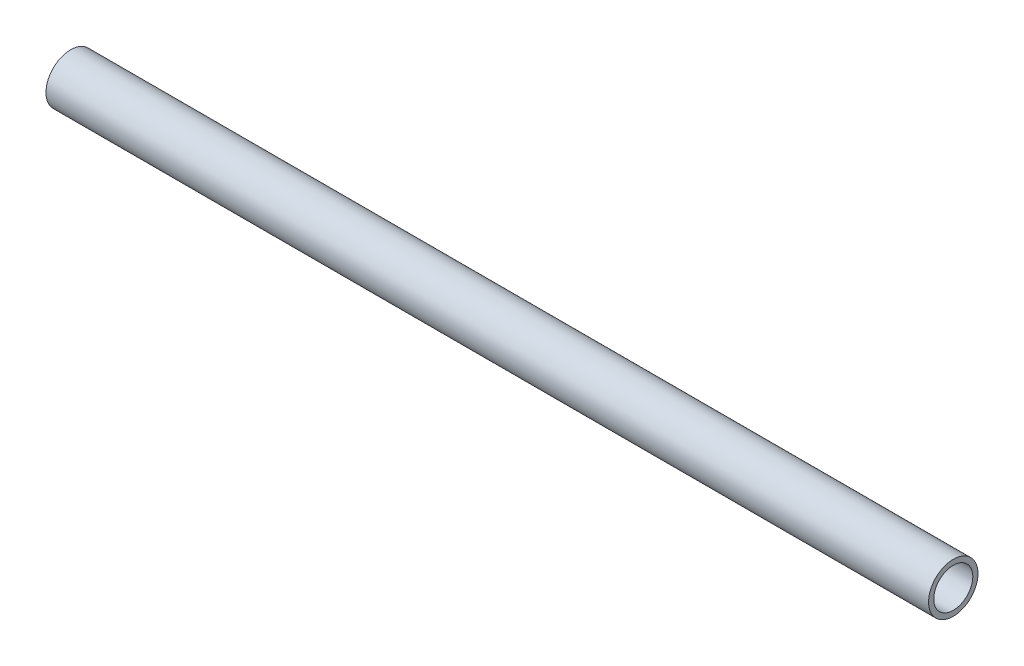
ISO-10303-21;
HEADER;
FILE_DESCRIPTION(('STEP AP214'),'2;1');
FILE_NAME('part.step','',(''),(''),'','','');
FILE_SCHEMA(('AUTOMOTIVE_DESIGN { 1 0 10303 214 1 1 1 1 }'));
ENDSEC;
DATA;
#1=APPLICATION_CONTEXT('core data for automotive mechanical design processes');
#2=APPLICATION_PROTOCOL_DEFINITION('international standard','automotive_design',2000,#1);
#3=PRODUCT_CONTEXT('',#1,'mechanical');
#4=PRODUCT('Part','Part','',(#3));
#5=PRODUCT_RELATED_PRODUCT_CATEGORY('part','',(#4));
#6=PRODUCT_DEFINITION_FORMATION('','',#4);
#7=PRODUCT_DEFINITION_CONTEXT('part definition',#1,'design');
#8=PRODUCT_DEFINITION('design','',#6,#7);
#9=PRODUCT_DEFINITION_SHAPE('','',#8);
#10=(LENGTH_UNIT() NAMED_UNIT(*) SI_UNIT(.MILLI.,.METRE.));
#11=(NAMED_UNIT(*) PLANE_ANGLE_UNIT() SI_UNIT($,.RADIAN.));
#12=(NAMED_UNIT(*) SI_UNIT($,.STERADIAN.) SOLID_ANGLE_UNIT());
#13=UNCERTAINTY_MEASURE_WITH_UNIT(LENGTH_MEASURE(1.E-05),#10,'distance_accuracy_value','');
#14=(GEOMETRIC_REPRESENTATION_CONTEXT(3) GLOBAL_UNCERTAINTY_ASSIGNED_CONTEXT((#13)) GLOBAL_UNIT_ASSIGNED_CONTEXT((#10,
#11,#12)) REPRESENTATION_CONTEXT('',''));
#15=CARTESIAN_POINT('',(0.,0.,0.));
#16=DIRECTION('',(0.,0.,1.));
#17=DIRECTION('',(1.,0.,0.));
#18=AXIS2_PLACEMENT_3D('',#15,#16,#17);
#19=CARTESIAN_POINT('',(340.,0.,0.));
#20=DIRECTION('',(1.,0.,0.));
#21=DIRECTION('',(0.,0.,-1.));
#22=AXIS2_PLACEMENT_3D('',#19,#20,#21);
#23=PLANE('',#22);
#24=CARTESIAN_POINT('',(340.,0.,0.));
#25=DIRECTION('',(1.,0.,0.));
#26=DIRECTION('',(0.,0.,-1.));
#27=AXIS2_PLACEMENT_3D('',#24,#25,#26);
#28=CIRCLE('',#27,9.525);
#29=CARTESIAN_POINT('',(340.,0.,-9.525));
#30=VERTEX_POINT('',#29);
#31=EDGE_CURVE('E10',#30,#30,#28,.T.);
#32=ORIENTED_EDGE('',*,*,#31,.T.);
#33=EDGE_LOOP('',(#32));
#34=FACE_BOUND('',#33,.T.);
#35=CARTESIAN_POINT('',(340.,0.,0.));
#36=DIRECTION('',(1.,0.,0.));
#37=DIRECTION('',(0.,0.,-1.));
#38=AXIS2_PLACEMENT_3D('',#35,#36,#37);
#39=CIRCLE('',#38,7.525);
#40=CARTESIAN_POINT('',(340.,0.,-7.525));
#41=VERTEX_POINT('',#40);
#42=EDGE_CURVE('E40',#41,#41,#39,.T.);
#43=ORIENTED_EDGE('',*,*,#42,.F.);
#44=EDGE_LOOP('',(#43));
#45=FACE_BOUND('',#44,.T.);
#46=ADVANCED_FACE('F29',(#34,#45),#23,.T.);
#47=CARTESIAN_POINT('',(0.,0.,0.));
#48=DIRECTION('',(1.,0.,0.));
#49=DIRECTION('',(0.,0.,-1.));
#50=AXIS2_PLACEMENT_3D('',#47,#48,#49);
#51=PLANE('',#50);
#52=CARTESIAN_POINT('',(0.,0.,0.));
#53=DIRECTION('',(1.,0.,0.));
#54=DIRECTION('',(0.,0.,-1.));
#55=AXIS2_PLACEMENT_3D('',#52,#53,#54);
#56=CIRCLE('',#55,9.525);
#57=CARTESIAN_POINT('',(0.,0.,-9.525));
#58=VERTEX_POINT('',#57);
#59=EDGE_CURVE('E33',#58,#58,#56,.T.);
#60=ORIENTED_EDGE('',*,*,#59,.F.);
#61=EDGE_LOOP('',(#60));
#62=FACE_BOUND('',#61,.T.);
#63=CARTESIAN_POINT('',(0.,0.,0.));
#64=DIRECTION('',(1.,0.,0.));
#65=DIRECTION('',(0.,0.,-1.));
#66=AXIS2_PLACEMENT_3D('',#63,#64,#65);
#67=CIRCLE('',#66,7.525);
#68=CARTESIAN_POINT('',(0.,0.,-7.525));
#69=VERTEX_POINT('',#68);
#70=EDGE_CURVE('E42',#69,#69,#67,.T.);
#71=ORIENTED_EDGE('',*,*,#70,.T.);
#72=EDGE_LOOP('',(#71));
#73=FACE_BOUND('',#72,.T.);
#74=ADVANCED_FACE('F52',(#62,#73),#51,.F.);
#75=CARTESIAN_POINT('',(340.,0.,0.));
#76=DIRECTION('',(-1.,0.,0.));
#77=DIRECTION('',(0.,0.,1.));
#78=AXIS2_PLACEMENT_3D('',#75,#76,#77);
#79=CYLINDRICAL_SURFACE('',#78,9.525);
#80=ORIENTED_EDGE('',*,*,#31,.F.);
#81=EDGE_LOOP('',(#80));
#82=FACE_BOUND('',#81,.T.);
#83=ORIENTED_EDGE('',*,*,#59,.T.);
#84=EDGE_LOOP('',(#83));
#85=FACE_BOUND('',#84,.T.);
#86=ADVANCED_FACE('F31',(#82,#85),#79,.T.);
#87=CARTESIAN_POINT('',(340.,0.,0.));
#88=DIRECTION('',(-1.,0.,0.));
#89=DIRECTION('',(0.,0.,1.));
#90=AXIS2_PLACEMENT_3D('',#87,#88,#89);
#91=CYLINDRICAL_SURFACE('',#90,7.525);
#92=ORIENTED_EDGE('',*,*,#42,.T.);
#93=EDGE_LOOP('',(#92));
#94=FACE_BOUND('',#93,.T.);
#95=ORIENTED_EDGE('',*,*,#70,.F.);
#96=EDGE_LOOP('',(#95));
#97=FACE_BOUND('',#96,.T.);
#98=ADVANCED_FACE('F48',(#94,#97),#91,.F.);
#99=CLOSED_SHELL('',(#46,#74,#86,#98));
#100=MANIFOLD_SOLID_BREP('B2',#99);
#101=ADVANCED_BREP_SHAPE_REPRESENTATION('',(#18,#100),#14);
#102=SHAPE_DEFINITION_REPRESENTATION(#9,#101);
ENDSEC;
END-ISO-10303-21;
